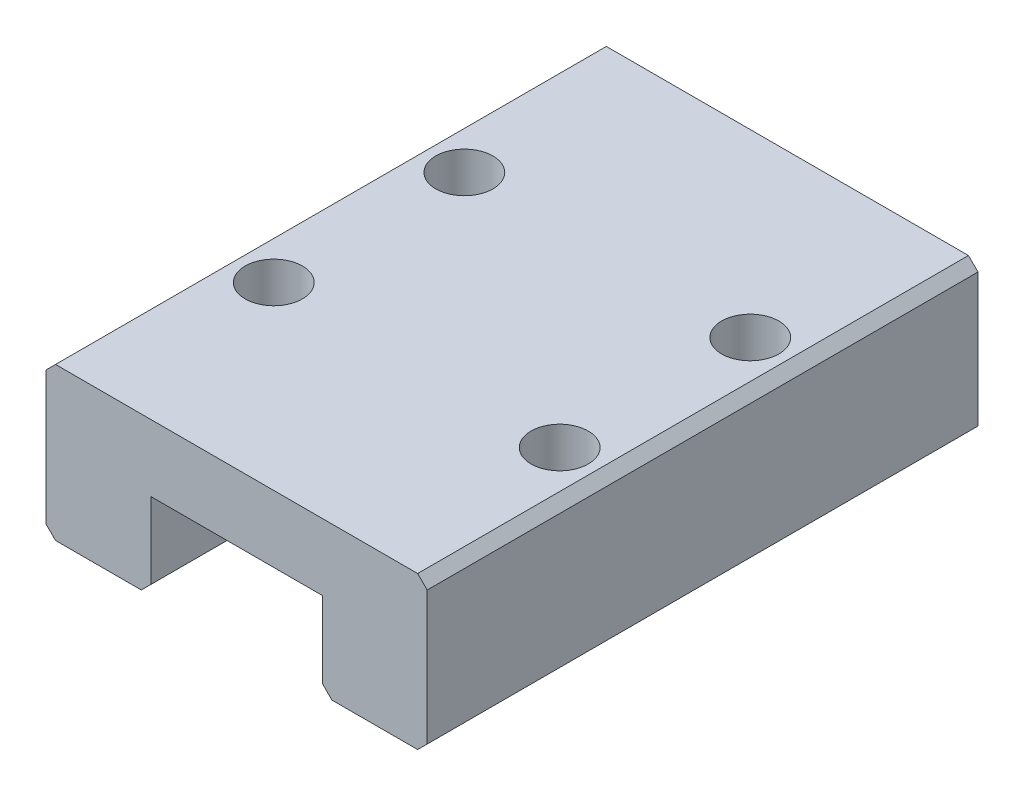
ISO-10303-21;
HEADER;
FILE_DESCRIPTION(('STEP AP214'),'2;1');
FILE_NAME('part.step','',(''),(''),'','','');
FILE_SCHEMA(('AUTOMOTIVE_DESIGN { 1 0 10303 214 1 1 1 1 }'));
ENDSEC;
DATA;
#1=APPLICATION_CONTEXT('core data for automotive mechanical design processes');
#2=APPLICATION_PROTOCOL_DEFINITION('international standard','automotive_design',2000,#1);
#3=PRODUCT_CONTEXT('',#1,'mechanical');
#4=PRODUCT('Part','Part','',(#3));
#5=PRODUCT_RELATED_PRODUCT_CATEGORY('part','',(#4));
#6=PRODUCT_DEFINITION_FORMATION('','',#4);
#7=PRODUCT_DEFINITION_CONTEXT('part definition',#1,'design');
#8=PRODUCT_DEFINITION('design','',#6,#7);
#9=PRODUCT_DEFINITION_SHAPE('','',#8);
#10=(LENGTH_UNIT() NAMED_UNIT(*) SI_UNIT(.MILLI.,.METRE.));
#11=(NAMED_UNIT(*) PLANE_ANGLE_UNIT() SI_UNIT($,.RADIAN.));
#12=(NAMED_UNIT(*) SI_UNIT($,.STERADIAN.) SOLID_ANGLE_UNIT());
#13=UNCERTAINTY_MEASURE_WITH_UNIT(LENGTH_MEASURE(1.E-05),#10,'distance_accuracy_value','');
#14=(GEOMETRIC_REPRESENTATION_CONTEXT(3) GLOBAL_UNCERTAINTY_ASSIGNED_CONTEXT((#13)) GLOBAL_UNIT_ASSIGNED_CONTEXT((#10,
#11,#12)) REPRESENTATION_CONTEXT('',''));
#15=CARTESIAN_POINT('',(0.,0.,0.));
#16=DIRECTION('',(0.,0.,1.));
#17=DIRECTION('',(1.,0.,0.));
#18=AXIS2_PLACEMENT_3D('',#15,#16,#17);
#19=CARTESIAN_POINT('',(4.5,0.,14.45));
#20=DIRECTION('',(1.,0.,0.));
#21=DIRECTION('',(0.,1.,0.));
#22=AXIS2_PLACEMENT_3D('',#19,#20,#21);
#23=PLANE('',#22);
#24=DIRECTION('',(0.,-1.,0.));
#25=VECTOR('',#24,1.);
#26=CARTESIAN_POINT('',(4.5,0.,-14.45));
#27=LINE('',#26,#25);
#28=CARTESIAN_POINT('',(4.5,0.,-14.45));
#29=VERTEX_POINT('',#28);
#30=CARTESIAN_POINT('',(4.5,-4.,-14.45));
#31=VERTEX_POINT('',#30);
#32=EDGE_CURVE('E169',#29,#31,#27,.T.);
#33=ORIENTED_EDGE('',*,*,#32,.T.);
#34=DIRECTION('',(0.,0.,1.));
#35=VECTOR('',#34,1.);
#36=CARTESIAN_POINT('',(4.5,-4.,14.45));
#37=LINE('',#36,#35);
#38=CARTESIAN_POINT('',(4.5,-4.,14.45));
#39=VERTEX_POINT('',#38);
#40=EDGE_CURVE('E207',#31,#39,#37,.T.);
#41=ORIENTED_EDGE('',*,*,#40,.T.);
#42=DIRECTION('',(0.,-1.,0.));
#43=VECTOR('',#42,1.);
#44=CARTESIAN_POINT('',(4.5,0.,14.45));
#45=LINE('',#44,#43);
#46=CARTESIAN_POINT('',(4.5,0.,14.45));
#47=VERTEX_POINT('',#46);
#48=EDGE_CURVE('E189',#47,#39,#45,.T.);
#49=ORIENTED_EDGE('',*,*,#48,.F.);
#50=DIRECTION('',(0.,0.,-1.));
#51=VECTOR('',#50,1.);
#52=CARTESIAN_POINT('',(4.5,0.,14.45));
#53=LINE('',#52,#51);
#54=EDGE_CURVE('E160',#47,#29,#53,.T.);
#55=ORIENTED_EDGE('',*,*,#54,.T.);
#56=EDGE_LOOP('',(#33,#41,#49,#55));
#57=FACE_BOUND('',#56,.T.);
#58=ADVANCED_FACE('F39',(#57),#23,.F.);
#59=CARTESIAN_POINT('',(4.5,-4.5,14.45));
#60=DIRECTION('',(0.,1.,0.));
#61=DIRECTION('',(-1.,0.,0.));
#62=AXIS2_PLACEMENT_3D('',#59,#60,#61);
#63=PLANE('',#62);
#64=DIRECTION('',(1.,0.,0.));
#65=VECTOR('',#64,1.);
#66=CARTESIAN_POINT('',(4.5,-4.5,14.45));
#67=LINE('',#66,#65);
#68=CARTESIAN_POINT('',(5.,-4.5,14.45));
#69=VERTEX_POINT('',#68);
#70=CARTESIAN_POINT('',(9.49999999999999,-4.5,14.45));
#71=VERTEX_POINT('',#70);
#72=EDGE_CURVE('E269',#69,#71,#67,.T.);
#73=ORIENTED_EDGE('',*,*,#72,.F.);
#74=DIRECTION('',(0.,0.,-1.));
#75=VECTOR('',#74,1.);
#76=CARTESIAN_POINT('',(5.,-4.5,14.45));
#77=LINE('',#76,#75);
#78=CARTESIAN_POINT('',(5.,-4.5,-14.45));
#79=VERTEX_POINT('',#78);
#80=EDGE_CURVE('E192',#69,#79,#77,.T.);
#81=ORIENTED_EDGE('',*,*,#80,.T.);
#82=DIRECTION('',(1.,0.,0.));
#83=VECTOR('',#82,1.);
#84=CARTESIAN_POINT('',(4.5,-4.5,-14.45));
#85=LINE('',#84,#83);
#86=CARTESIAN_POINT('',(9.49999999999999,-4.5,-14.45));
#87=VERTEX_POINT('',#86);
#88=EDGE_CURVE('E172',#79,#87,#85,.T.);
#89=ORIENTED_EDGE('',*,*,#88,.T.);
#90=DIRECTION('',(0.,0.,1.));
#91=VECTOR('',#90,1.);
#92=CARTESIAN_POINT('',(9.49999999999999,-4.5,14.45));
#93=LINE('',#92,#91);
#94=EDGE_CURVE('E159',#87,#71,#93,.T.);
#95=ORIENTED_EDGE('',*,*,#94,.T.);
#96=EDGE_LOOP('',(#73,#81,#89,#95));
#97=FACE_BOUND('',#96,.T.);
#98=ADVANCED_FACE('F327',(#97),#63,.F.);
#99=CARTESIAN_POINT('',(10.,-4.5,14.45));
#100=DIRECTION('',(-1.,0.,0.));
#101=DIRECTION('',(0.,0.,1.));
#102=AXIS2_PLACEMENT_3D('',#99,#100,#101);
#103=PLANE('',#102);
#104=DIRECTION('',(0.,1.,0.));
#105=VECTOR('',#104,1.);
#106=CARTESIAN_POINT('',(10.,-4.5,14.45));
#107=LINE('',#106,#105);
#108=CARTESIAN_POINT('',(10.,-4.,14.45));
#109=VERTEX_POINT('',#108);
#110=CARTESIAN_POINT('',(10.,3.00000000000001,14.45));
#111=VERTEX_POINT('',#110);
#112=EDGE_CURVE('E250',#109,#111,#107,.T.);
#113=ORIENTED_EDGE('',*,*,#112,.F.);
#114=DIRECTION('',(0.,0.,-1.));
#115=VECTOR('',#114,1.);
#116=CARTESIAN_POINT('',(10.,-4.,14.45));
#117=LINE('',#116,#115);
#118=CARTESIAN_POINT('',(10.,-4.,-14.45));
#119=VERTEX_POINT('',#118);
#120=EDGE_CURVE('E228',#109,#119,#117,.T.);
#121=ORIENTED_EDGE('',*,*,#120,.T.);
#122=DIRECTION('',(0.,1.,0.));
#123=VECTOR('',#122,1.);
#124=CARTESIAN_POINT('',(10.,-4.5,-14.45));
#125=LINE('',#124,#123);
#126=CARTESIAN_POINT('',(10.,3.00000000000001,-14.45));
#127=VERTEX_POINT('',#126);
#128=EDGE_CURVE('E176',#119,#127,#125,.T.);
#129=ORIENTED_EDGE('',*,*,#128,.T.);
#130=DIRECTION('',(0.,0.,1.));
#131=VECTOR('',#130,1.);
#132=CARTESIAN_POINT('',(10.,3.00000000000001,14.45));
#133=LINE('',#132,#131);
#134=EDGE_CURVE('E226',#127,#111,#133,.T.);
#135=ORIENTED_EDGE('',*,*,#134,.T.);
#136=EDGE_LOOP('',(#113,#121,#129,#135));
#137=FACE_BOUND('',#136,.T.);
#138=ADVANCED_FACE('F308',(#137),#103,.F.);
#139=CARTESIAN_POINT('',(-10.,3.5,14.45));
#140=DIRECTION('',(0.,-1.,0.));
#141=DIRECTION('',(1.,0.,0.));
#142=AXIS2_PLACEMENT_3D('',#139,#140,#141);
#143=PLANE('',#142);
#144=CARTESIAN_POINT('',(7.49999999999999,3.5,-5.));
#145=DIRECTION('',(0.,1.,0.));
#146=DIRECTION('',(-1.,0.,0.));
#147=AXIS2_PLACEMENT_3D('',#144,#145,#146);
#148=CIRCLE('',#147,1.5);
#149=CARTESIAN_POINT('',(6.,3.5,-5.));
#150=VERTEX_POINT('',#149);
#151=EDGE_CURVE('E286',#150,#150,#148,.T.);
#152=ORIENTED_EDGE('',*,*,#151,.F.);
#153=EDGE_LOOP('',(#152));
#154=FACE_BOUND('',#153,.T.);
#155=CARTESIAN_POINT('',(-7.50000000000001,3.5,5.));
#156=DIRECTION('',(0.,1.,0.));
#157=DIRECTION('',(-1.,0.,0.));
#158=AXIS2_PLACEMENT_3D('',#155,#156,#157);
#159=CIRCLE('',#158,1.5);
#160=CARTESIAN_POINT('',(-9.00000000000001,3.50000000000001,5.));
#161=VERTEX_POINT('',#160);
#162=EDGE_CURVE('E279',#161,#161,#159,.T.);
#163=ORIENTED_EDGE('',*,*,#162,.F.);
#164=EDGE_LOOP('',(#163));
#165=FACE_BOUND('',#164,.T.);
#166=CARTESIAN_POINT('',(7.49999999999999,3.5,5.));
#167=DIRECTION('',(0.,1.,0.));
#168=DIRECTION('',(-1.,0.,0.));
#169=AXIS2_PLACEMENT_3D('',#166,#167,#168);
#170=CIRCLE('',#169,1.5);
#171=CARTESIAN_POINT('',(5.99999999999999,3.5,5.));
#172=VERTEX_POINT('',#171);
#173=EDGE_CURVE('E291',#172,#172,#170,.T.);
#174=ORIENTED_EDGE('',*,*,#173,.F.);
#175=EDGE_LOOP('',(#174));
#176=FACE_BOUND('',#175,.T.);
#177=CARTESIAN_POINT('',(-7.50000000000001,3.5,-5.));
#178=DIRECTION('',(0.,1.,0.));
#179=DIRECTION('',(-1.,0.,0.));
#180=AXIS2_PLACEMENT_3D('',#177,#178,#179);
#181=CIRCLE('',#180,1.5);
#182=CARTESIAN_POINT('',(-9.00000000000001,3.50000000000001,-5.));
#183=VERTEX_POINT('',#182);
#184=EDGE_CURVE('E273',#183,#183,#181,.T.);
#185=ORIENTED_EDGE('',*,*,#184,.F.);
#186=EDGE_LOOP('',(#185));
#187=FACE_BOUND('',#186,.T.);
#188=DIRECTION('',(-1.,0.,0.));
#189=VECTOR('',#188,1.);
#190=CARTESIAN_POINT('',(-10.,3.5,14.45));
#191=LINE('',#190,#189);
#192=CARTESIAN_POINT('',(9.5,3.5,14.45));
#193=VERTEX_POINT('',#192);
#194=CARTESIAN_POINT('',(-9.5,3.5,14.45));
#195=VERTEX_POINT('',#194);
#196=EDGE_CURVE('E240',#193,#195,#191,.T.);
#197=ORIENTED_EDGE('',*,*,#196,.F.);
#198=DIRECTION('',(0.,0.,-1.));
#199=VECTOR('',#198,1.);
#200=CARTESIAN_POINT('',(9.5,3.5,14.45));
#201=LINE('',#200,#199);
#202=CARTESIAN_POINT('',(9.5,3.5,-14.45));
#203=VERTEX_POINT('',#202);
#204=EDGE_CURVE('E11',#193,#203,#201,.T.);
#205=ORIENTED_EDGE('',*,*,#204,.T.);
#206=DIRECTION('',(-1.,0.,0.));
#207=VECTOR('',#206,1.);
#208=CARTESIAN_POINT('',(-10.,3.5,-14.45));
#209=LINE('',#208,#207);
#210=CARTESIAN_POINT('',(-9.5,3.5,-14.45));
#211=VERTEX_POINT('',#210);
#212=EDGE_CURVE('E179',#203,#211,#209,.T.);
#213=ORIENTED_EDGE('',*,*,#212,.T.);
#214=DIRECTION('',(0.,0.,1.));
#215=VECTOR('',#214,1.);
#216=CARTESIAN_POINT('',(-9.5,3.5,14.45));
#217=LINE('',#216,#215);
#218=EDGE_CURVE('E48',#211,#195,#217,.T.);
#219=ORIENTED_EDGE('',*,*,#218,.T.);
#220=EDGE_LOOP('',(#197,#205,#213,#219));
#221=FACE_BOUND('',#220,.T.);
#222=ADVANCED_FACE('F239',(#154,#165,#176,#187,#221),#143,.F.);
#223=CARTESIAN_POINT('',(-10.,-4.5,14.45));
#224=DIRECTION('',(1.,0.,0.));
#225=DIRECTION('',(0.,0.,-1.));
#226=AXIS2_PLACEMENT_3D('',#223,#224,#225);
#227=PLANE('',#226);
#228=DIRECTION('',(0.,-1.,0.));
#229=VECTOR('',#228,1.);
#230=CARTESIAN_POINT('',(-10.,-4.5,-14.45));
#231=LINE('',#230,#229);
#232=CARTESIAN_POINT('',(-10.,3.,-14.45));
#233=VERTEX_POINT('',#232);
#234=CARTESIAN_POINT('',(-10.,-4.,-14.45));
#235=VERTEX_POINT('',#234);
#236=EDGE_CURVE('E182',#233,#235,#231,.T.);
#237=ORIENTED_EDGE('',*,*,#236,.T.);
#238=DIRECTION('',(0.,0.,1.));
#239=VECTOR('',#238,1.);
#240=CARTESIAN_POINT('',(-10.,-4.,14.45));
#241=LINE('',#240,#239);
#242=CARTESIAN_POINT('',(-10.,-4.,14.45));
#243=VERTEX_POINT('',#242);
#244=EDGE_CURVE('E234',#235,#243,#241,.T.);
#245=ORIENTED_EDGE('',*,*,#244,.T.);
#246=DIRECTION('',(0.,-1.,0.));
#247=VECTOR('',#246,1.);
#248=CARTESIAN_POINT('',(-10.,-4.5,14.45));
#249=LINE('',#248,#247);
#250=CARTESIAN_POINT('',(-10.,3.,14.45));
#251=VERTEX_POINT('',#250);
#252=EDGE_CURVE('E249',#251,#243,#249,.T.);
#253=ORIENTED_EDGE('',*,*,#252,.F.);
#254=DIRECTION('',(0.,0.,-1.));
#255=VECTOR('',#254,1.);
#256=CARTESIAN_POINT('',(-10.,3.,14.45));
#257=LINE('',#256,#255);
#258=EDGE_CURVE('E231',#251,#233,#257,.T.);
#259=ORIENTED_EDGE('',*,*,#258,.T.);
#260=EDGE_LOOP('',(#237,#245,#253,#259));
#261=FACE_BOUND('',#260,.T.);
#262=ADVANCED_FACE('F255',(#261),#227,.F.);
#263=CARTESIAN_POINT('',(-4.5,-4.5,14.45));
#264=DIRECTION('',(0.,1.,0.));
#265=DIRECTION('',(-1.,0.,0.));
#266=AXIS2_PLACEMENT_3D('',#263,#264,#265);
#267=PLANE('',#266);
#268=DIRECTION('',(1.,0.,0.));
#269=VECTOR('',#268,1.);
#270=CARTESIAN_POINT('',(-4.5,-4.5,-14.45));
#271=LINE('',#270,#269);
#272=CARTESIAN_POINT('',(-9.5,-4.5,-14.45));
#273=VERTEX_POINT('',#272);
#274=CARTESIAN_POINT('',(-5.,-4.5,-14.45));
#275=VERTEX_POINT('',#274);
#276=EDGE_CURVE('E185',#273,#275,#271,.T.);
#277=ORIENTED_EDGE('',*,*,#276,.T.);
#278=DIRECTION('',(0.,0.,1.));
#279=VECTOR('',#278,1.);
#280=CARTESIAN_POINT('',(-5.,-4.5,14.45));
#281=LINE('',#280,#279);
#282=CARTESIAN_POINT('',(-5.,-4.5,14.45));
#283=VERTEX_POINT('',#282);
#284=EDGE_CURVE('E63',#275,#283,#281,.T.);
#285=ORIENTED_EDGE('',*,*,#284,.T.);
#286=DIRECTION('',(1.,0.,0.));
#287=VECTOR('',#286,1.);
#288=CARTESIAN_POINT('',(-4.5,-4.5,14.45));
#289=LINE('',#288,#287);
#290=CARTESIAN_POINT('',(-9.5,-4.5,14.45));
#291=VERTEX_POINT('',#290);
#292=EDGE_CURVE('E150',#291,#283,#289,.T.);
#293=ORIENTED_EDGE('',*,*,#292,.F.);
#294=DIRECTION('',(0.,0.,-1.));
#295=VECTOR('',#294,1.);
#296=CARTESIAN_POINT('',(-9.5,-4.5,14.45));
#297=LINE('',#296,#295);
#298=EDGE_CURVE('E222',#291,#273,#297,.T.);
#299=ORIENTED_EDGE('',*,*,#298,.T.);
#300=EDGE_LOOP('',(#277,#285,#293,#299));
#301=FACE_BOUND('',#300,.T.);
#302=ADVANCED_FACE('F265',(#301),#267,.F.);
#303=CARTESIAN_POINT('',(-4.5,0.,14.45));
#304=DIRECTION('',(-1.,0.,0.));
#305=DIRECTION('',(0.,-1.,0.));
#306=AXIS2_PLACEMENT_3D('',#303,#304,#305);
#307=PLANE('',#306);
#308=DIRECTION('',(0.,1.,0.));
#309=VECTOR('',#308,1.);
#310=CARTESIAN_POINT('',(-4.5,0.,14.45));
#311=LINE('',#310,#309);
#312=CARTESIAN_POINT('',(-4.5,-4.,14.45));
#313=VERTEX_POINT('',#312);
#314=CARTESIAN_POINT('',(-4.5,0.,14.45));
#315=VERTEX_POINT('',#314);
#316=EDGE_CURVE('E140',#313,#315,#311,.T.);
#317=ORIENTED_EDGE('',*,*,#316,.F.);
#318=DIRECTION('',(0.,0.,-1.));
#319=VECTOR('',#318,1.);
#320=CARTESIAN_POINT('',(-4.5,-4.,14.45));
#321=LINE('',#320,#319);
#322=CARTESIAN_POINT('',(-4.5,-4.,-14.45));
#323=VERTEX_POINT('',#322);
#324=EDGE_CURVE('E220',#313,#323,#321,.T.);
#325=ORIENTED_EDGE('',*,*,#324,.T.);
#326=DIRECTION('',(0.,1.,0.));
#327=VECTOR('',#326,1.);
#328=CARTESIAN_POINT('',(-4.5,0.,-14.45));
#329=LINE('',#328,#327);
#330=CARTESIAN_POINT('',(-4.5,0.,-14.45));
#331=VERTEX_POINT('',#330);
#332=EDGE_CURVE('E156',#323,#331,#329,.T.);
#333=ORIENTED_EDGE('',*,*,#332,.T.);
#334=DIRECTION('',(0.,0.,-1.));
#335=VECTOR('',#334,1.);
#336=CARTESIAN_POINT('',(-4.5,0.,14.45));
#337=LINE('',#336,#335);
#338=EDGE_CURVE('E153',#315,#331,#337,.T.);
#339=ORIENTED_EDGE('',*,*,#338,.F.);
#340=EDGE_LOOP('',(#317,#325,#333,#339));
#341=FACE_BOUND('',#340,.T.);
#342=ADVANCED_FACE('F154',(#341),#307,.F.);
#343=CARTESIAN_POINT('',(4.5,0.,14.45));
#344=DIRECTION('',(0.,1.,0.));
#345=DIRECTION('',(-1.,0.,0.));
#346=AXIS2_PLACEMENT_3D('',#343,#344,#345);
#347=PLANE('',#346);
#348=DIRECTION('',(1.,0.,0.));
#349=VECTOR('',#348,1.);
#350=CARTESIAN_POINT('',(4.5,0.,-14.45));
#351=LINE('',#350,#349);
#352=EDGE_CURVE('E188',#331,#29,#351,.T.);
#353=ORIENTED_EDGE('',*,*,#352,.T.);
#354=ORIENTED_EDGE('',*,*,#54,.F.);
#355=DIRECTION('',(1.,0.,0.));
#356=VECTOR('',#355,1.);
#357=CARTESIAN_POINT('',(4.5,0.,14.45));
#358=LINE('',#357,#356);
#359=EDGE_CURVE('E145',#315,#47,#358,.T.);
#360=ORIENTED_EDGE('',*,*,#359,.F.);
#361=ORIENTED_EDGE('',*,*,#338,.T.);
#362=EDGE_LOOP('',(#353,#354,#360,#361));
#363=FACE_BOUND('',#362,.T.);
#364=ADVANCED_FACE('F162',(#363),#347,.F.);
#365=CARTESIAN_POINT('',(0.,0.,14.45));
#366=DIRECTION('',(0.,0.,1.));
#367=DIRECTION('',(1.,0.,0.));
#368=AXIS2_PLACEMENT_3D('',#365,#366,#367);
#369=PLANE('',#368);
#370=ORIENTED_EDGE('',*,*,#48,.T.);
#371=DIRECTION('',(-0.707106781186548,0.707106781186548,0.));
#372=VECTOR('',#371,1.);
#373=CARTESIAN_POINT('',(0.249999999999999,0.249999999999999,14.45));
#374=LINE('',#373,#372);
#375=EDGE_CURVE('E218',#39,#69,#374,.F.);
#376=ORIENTED_EDGE('',*,*,#375,.T.);
#377=ORIENTED_EDGE('',*,*,#72,.T.);
#378=DIRECTION('',(-0.70710678118655,-0.707106781186545,0.));
#379=VECTOR('',#378,1.);
#380=CARTESIAN_POINT('',(6.99999999999996,-7.00000000000001,14.45));
#381=LINE('',#380,#379);
#382=EDGE_CURVE('E215',#71,#109,#381,.F.);
#383=ORIENTED_EDGE('',*,*,#382,.T.);
#384=ORIENTED_EDGE('',*,*,#112,.T.);
#385=DIRECTION('',(0.707106781186548,-0.707106781186548,0.));
#386=VECTOR('',#385,1.);
#387=CARTESIAN_POINT('',(6.5,6.5,14.45));
#388=LINE('',#387,#386);
#389=EDGE_CURVE('E211',#111,#193,#388,.F.);
#390=ORIENTED_EDGE('',*,*,#389,.T.);
#391=ORIENTED_EDGE('',*,*,#196,.T.);
#392=DIRECTION('',(0.707106781186548,0.707106781186548,0.));
#393=VECTOR('',#392,1.);
#394=CARTESIAN_POINT('',(-6.5,6.5,14.45));
#395=LINE('',#394,#393);
#396=EDGE_CURVE('E209',#195,#251,#395,.F.);
#397=ORIENTED_EDGE('',*,*,#396,.T.);
#398=ORIENTED_EDGE('',*,*,#252,.T.);
#399=DIRECTION('',(-0.707106781186548,0.707106781186548,0.));
#400=VECTOR('',#399,1.);
#401=CARTESIAN_POINT('',(-7.,-7.,14.45));
#402=LINE('',#401,#400);
#403=EDGE_CURVE('E213',#243,#291,#402,.F.);
#404=ORIENTED_EDGE('',*,*,#403,.T.);
#405=ORIENTED_EDGE('',*,*,#292,.T.);
#406=DIRECTION('',(-0.707106781186548,-0.707106781186548,0.));
#407=VECTOR('',#406,1.);
#408=CARTESIAN_POINT('',(-0.250000000000001,0.250000000000001,14.45));
#409=LINE('',#408,#407);
#410=EDGE_CURVE('E55',#283,#313,#409,.F.);
#411=ORIENTED_EDGE('',*,*,#410,.T.);
#412=ORIENTED_EDGE('',*,*,#316,.T.);
#413=ORIENTED_EDGE('',*,*,#359,.T.);
#414=EDGE_LOOP('',(#370,#376,#377,#383,#384,#390,#391,#397,#398,#404,#405,#411,#412,#413));
#415=FACE_BOUND('',#414,.T.);
#416=ADVANCED_FACE('F143',(#415),#369,.T.);
#417=CARTESIAN_POINT('',(0.,0.,-14.45));
#418=DIRECTION('',(0.,0.,1.));
#419=DIRECTION('',(1.,0.,0.));
#420=AXIS2_PLACEMENT_3D('',#417,#418,#419);
#421=PLANE('',#420);
#422=ORIENTED_EDGE('',*,*,#88,.F.);
#423=DIRECTION('',(0.707106781186548,-0.707106781186548,0.));
#424=VECTOR('',#423,1.);
#425=CARTESIAN_POINT('',(5.,-4.5,-14.45));
#426=LINE('',#425,#424);
#427=EDGE_CURVE('E205',#79,#31,#426,.F.);
#428=ORIENTED_EDGE('',*,*,#427,.T.);
#429=ORIENTED_EDGE('',*,*,#32,.F.);
#430=ORIENTED_EDGE('',*,*,#352,.F.);
#431=ORIENTED_EDGE('',*,*,#332,.F.);
#432=DIRECTION('',(0.707106781186548,0.707106781186548,0.));
#433=VECTOR('',#432,1.);
#434=CARTESIAN_POINT('',(-4.5,-4.,-14.45));
#435=LINE('',#434,#433);
#436=EDGE_CURVE('E203',#323,#275,#435,.F.);
#437=ORIENTED_EDGE('',*,*,#436,.T.);
#438=ORIENTED_EDGE('',*,*,#276,.F.);
#439=DIRECTION('',(0.707106781186548,-0.707106781186548,0.));
#440=VECTOR('',#439,1.);
#441=CARTESIAN_POINT('',(-9.5,-4.5,-14.45));
#442=LINE('',#441,#440);
#443=EDGE_CURVE('E199',#273,#235,#442,.F.);
#444=ORIENTED_EDGE('',*,*,#443,.T.);
#445=ORIENTED_EDGE('',*,*,#236,.F.);
#446=DIRECTION('',(-0.707106781186548,-0.707106781186548,0.));
#447=VECTOR('',#446,1.);
#448=CARTESIAN_POINT('',(-10.,3.,-14.45));
#449=LINE('',#448,#447);
#450=EDGE_CURVE('E195',#233,#211,#449,.F.);
#451=ORIENTED_EDGE('',*,*,#450,.T.);
#452=ORIENTED_EDGE('',*,*,#212,.F.);
#453=DIRECTION('',(-0.707106781186548,0.707106781186548,0.));
#454=VECTOR('',#453,1.);
#455=CARTESIAN_POINT('',(9.5,3.5,-14.45));
#456=LINE('',#455,#454);
#457=EDGE_CURVE('E197',#203,#127,#456,.F.);
#458=ORIENTED_EDGE('',*,*,#457,.T.);
#459=ORIENTED_EDGE('',*,*,#128,.F.);
#460=DIRECTION('',(0.70710678118655,0.707106781186545,0.));
#461=VECTOR('',#460,1.);
#462=CARTESIAN_POINT('',(10.,-4.,-14.45));
#463=LINE('',#462,#461);
#464=EDGE_CURVE('E201',#119,#87,#463,.F.);
#465=ORIENTED_EDGE('',*,*,#464,.T.);
#466=EDGE_LOOP('',(#422,#428,#429,#430,#431,#437,#438,#444,#445,#451,#452,#458,#459,#465));
#467=FACE_BOUND('',#466,.T.);
#468=ADVANCED_FACE('F259',(#467),#421,.F.);
#469=CARTESIAN_POINT('',(-7.50000000000001,0.500000000000004,-5.));
#470=DIRECTION('',(0.,1.,0.));
#471=DIRECTION('',(-1.,0.,0.));
#472=AXIS2_PLACEMENT_3D('',#469,#470,#471);
#473=CYLINDRICAL_SURFACE('',#472,1.5);
#474=CARTESIAN_POINT('',(-7.50000000000001,0.500000000000004,-5.));
#475=DIRECTION('',(0.,1.,0.));
#476=DIRECTION('',(-1.,0.,0.));
#477=AXIS2_PLACEMENT_3D('',#474,#475,#476);
#478=CIRCLE('',#477,1.5);
#479=CARTESIAN_POINT('',(-9.00000000000001,0.500000000000005,-5.));
#480=VERTEX_POINT('',#479);
#481=EDGE_CURVE('E173',#480,#480,#478,.T.);
#482=ORIENTED_EDGE('',*,*,#481,.F.);
#483=EDGE_LOOP('',(#482));
#484=FACE_BOUND('',#483,.T.);
#485=ORIENTED_EDGE('',*,*,#184,.T.);
#486=EDGE_LOOP('',(#485));
#487=FACE_BOUND('',#486,.T.);
#488=ADVANCED_FACE('F313',(#484,#487),#473,.F.);
#489=CARTESIAN_POINT('',(-7.50000000000001,0.500000000000004,-5.));
#490=DIRECTION('',(0.,1.,0.));
#491=DIRECTION('',(-1.,0.,0.));
#492=AXIS2_PLACEMENT_3D('',#489,#490,#491);
#493=PLANE('',#492);
#494=ORIENTED_EDGE('',*,*,#481,.T.);
#495=EDGE_LOOP('',(#494));
#496=FACE_BOUND('',#495,.T.);
#497=ADVANCED_FACE('F302',(#496),#493,.T.);
#498=CARTESIAN_POINT('',(7.49999999999999,0.499999999999997,5.));
#499=DIRECTION('',(0.,1.,0.));
#500=DIRECTION('',(-1.,0.,0.));
#501=AXIS2_PLACEMENT_3D('',#498,#499,#500);
#502=CYLINDRICAL_SURFACE('',#501,1.5);
#503=CARTESIAN_POINT('',(7.49999999999999,0.499999999999997,5.));
#504=DIRECTION('',(0.,1.,0.));
#505=DIRECTION('',(-1.,0.,0.));
#506=AXIS2_PLACEMENT_3D('',#503,#504,#505);
#507=CIRCLE('',#506,1.5);
#508=CARTESIAN_POINT('',(5.99999999999999,0.499999999999998,5.));
#509=VERTEX_POINT('',#508);
#510=EDGE_CURVE('E283',#509,#509,#507,.T.);
#511=ORIENTED_EDGE('',*,*,#510,.F.);
#512=EDGE_LOOP('',(#511));
#513=FACE_BOUND('',#512,.T.);
#514=ORIENTED_EDGE('',*,*,#173,.T.);
#515=EDGE_LOOP('',(#514));
#516=FACE_BOUND('',#515,.T.);
#517=ADVANCED_FACE('F299',(#513,#516),#502,.F.);
#518=CARTESIAN_POINT('',(7.49999999999999,0.499999999999997,5.));
#519=DIRECTION('',(0.,1.,0.));
#520=DIRECTION('',(-1.,0.,0.));
#521=AXIS2_PLACEMENT_3D('',#518,#519,#520);
#522=PLANE('',#521);
#523=ORIENTED_EDGE('',*,*,#510,.T.);
#524=EDGE_LOOP('',(#523));
#525=FACE_BOUND('',#524,.T.);
#526=ADVANCED_FACE('F297',(#525),#522,.T.);
#527=CARTESIAN_POINT('',(-7.50000000000001,0.500000000000004,5.));
#528=DIRECTION('',(0.,1.,0.));
#529=DIRECTION('',(-1.,0.,0.));
#530=AXIS2_PLACEMENT_3D('',#527,#528,#529);
#531=CYLINDRICAL_SURFACE('',#530,1.5);
#532=CARTESIAN_POINT('',(-7.50000000000001,0.500000000000004,5.));
#533=DIRECTION('',(0.,1.,0.));
#534=DIRECTION('',(-1.,0.,0.));
#535=AXIS2_PLACEMENT_3D('',#532,#533,#534);
#536=CIRCLE('',#535,1.5);
#537=CARTESIAN_POINT('',(-9.00000000000001,0.500000000000005,5.));
#538=VERTEX_POINT('',#537);
#539=EDGE_CURVE('E282',#538,#538,#536,.T.);
#540=ORIENTED_EDGE('',*,*,#539,.F.);
#541=EDGE_LOOP('',(#540));
#542=FACE_BOUND('',#541,.T.);
#543=ORIENTED_EDGE('',*,*,#162,.T.);
#544=EDGE_LOOP('',(#543));
#545=FACE_BOUND('',#544,.T.);
#546=ADVANCED_FACE('F464',(#542,#545),#531,.F.);
#547=CARTESIAN_POINT('',(-7.50000000000001,0.500000000000004,5.));
#548=DIRECTION('',(0.,1.,0.));
#549=DIRECTION('',(-1.,0.,0.));
#550=AXIS2_PLACEMENT_3D('',#547,#548,#549);
#551=PLANE('',#550);
#552=ORIENTED_EDGE('',*,*,#539,.T.);
#553=EDGE_LOOP('',(#552));
#554=FACE_BOUND('',#553,.T.);
#555=ADVANCED_FACE('F456',(#554),#551,.T.);
#556=CARTESIAN_POINT('',(7.49999999999999,0.499999999999997,-5.));
#557=DIRECTION('',(0.,1.,0.));
#558=DIRECTION('',(-1.,0.,0.));
#559=AXIS2_PLACEMENT_3D('',#556,#557,#558);
#560=CYLINDRICAL_SURFACE('',#559,1.5);
#561=CARTESIAN_POINT('',(7.49999999999999,0.499999999999997,-5.));
#562=DIRECTION('',(0.,1.,0.));
#563=DIRECTION('',(-1.,0.,0.));
#564=AXIS2_PLACEMENT_3D('',#561,#562,#563);
#565=CIRCLE('',#564,1.5);
#566=CARTESIAN_POINT('',(5.99999999999999,0.499999999999998,-5.));
#567=VERTEX_POINT('',#566);
#568=EDGE_CURVE('E276',#567,#567,#565,.T.);
#569=ORIENTED_EDGE('',*,*,#568,.F.);
#570=EDGE_LOOP('',(#569));
#571=FACE_BOUND('',#570,.T.);
#572=ORIENTED_EDGE('',*,*,#151,.T.);
#573=EDGE_LOOP('',(#572));
#574=FACE_BOUND('',#573,.T.);
#575=ADVANCED_FACE('F449',(#571,#574),#560,.F.);
#576=CARTESIAN_POINT('',(7.49999999999999,0.499999999999997,-5.));
#577=DIRECTION('',(0.,1.,0.));
#578=DIRECTION('',(-1.,0.,0.));
#579=AXIS2_PLACEMENT_3D('',#576,#577,#578);
#580=PLANE('',#579);
#581=ORIENTED_EDGE('',*,*,#568,.T.);
#582=EDGE_LOOP('',(#581));
#583=FACE_BOUND('',#582,.T.);
#584=ADVANCED_FACE('F345',(#583),#580,.T.);
#585=CARTESIAN_POINT('',(5.,-4.5,14.45));
#586=DIRECTION('',(0.707106781186547,0.707106781186547,0.));
#587=DIRECTION('',(0.,0.,-1.));
#588=AXIS2_PLACEMENT_3D('',#585,#586,#587);
#589=PLANE('',#588);
#590=ORIENTED_EDGE('',*,*,#375,.F.);
#591=ORIENTED_EDGE('',*,*,#40,.F.);
#592=ORIENTED_EDGE('',*,*,#427,.F.);
#593=ORIENTED_EDGE('',*,*,#80,.F.);
#594=EDGE_LOOP('',(#590,#591,#592,#593));
#595=FACE_BOUND('',#594,.T.);
#596=ADVANCED_FACE('F338',(#595),#589,.F.);
#597=CARTESIAN_POINT('',(-4.5,-4.,14.45));
#598=DIRECTION('',(-0.707106781186547,0.707106781186547,0.));
#599=DIRECTION('',(0.,0.,-1.));
#600=AXIS2_PLACEMENT_3D('',#597,#598,#599);
#601=PLANE('',#600);
#602=ORIENTED_EDGE('',*,*,#410,.F.);
#603=ORIENTED_EDGE('',*,*,#284,.F.);
#604=ORIENTED_EDGE('',*,*,#436,.F.);
#605=ORIENTED_EDGE('',*,*,#324,.F.);
#606=EDGE_LOOP('',(#602,#603,#604,#605));
#607=FACE_BOUND('',#606,.T.);
#608=ADVANCED_FACE('F344',(#607),#601,.F.);
#609=CARTESIAN_POINT('',(10.,-4.,14.45));
#610=DIRECTION('',(-0.707106781186545,0.70710678118655,0.));
#611=DIRECTION('',(0.,0.,-1.));
#612=AXIS2_PLACEMENT_3D('',#609,#610,#611);
#613=PLANE('',#612);
#614=ORIENTED_EDGE('',*,*,#382,.F.);
#615=ORIENTED_EDGE('',*,*,#94,.F.);
#616=ORIENTED_EDGE('',*,*,#464,.F.);
#617=ORIENTED_EDGE('',*,*,#120,.F.);
#618=EDGE_LOOP('',(#614,#615,#616,#617));
#619=FACE_BOUND('',#618,.T.);
#620=ADVANCED_FACE('F352',(#619),#613,.F.);
#621=CARTESIAN_POINT('',(-9.5,-4.5,14.45));
#622=DIRECTION('',(0.707106781186547,0.707106781186547,0.));
#623=DIRECTION('',(0.,0.,-1.));
#624=AXIS2_PLACEMENT_3D('',#621,#622,#623);
#625=PLANE('',#624);
#626=ORIENTED_EDGE('',*,*,#403,.F.);
#627=ORIENTED_EDGE('',*,*,#244,.F.);
#628=ORIENTED_EDGE('',*,*,#443,.F.);
#629=ORIENTED_EDGE('',*,*,#298,.F.);
#630=EDGE_LOOP('',(#626,#627,#628,#629));
#631=FACE_BOUND('',#630,.T.);
#632=ADVANCED_FACE('F264',(#631),#625,.F.);
#633=CARTESIAN_POINT('',(9.5,3.5,14.45));
#634=DIRECTION('',(-0.707106781186547,-0.707106781186547,0.));
#635=DIRECTION('',(0.,0.,-1.));
#636=AXIS2_PLACEMENT_3D('',#633,#634,#635);
#637=PLANE('',#636);
#638=ORIENTED_EDGE('',*,*,#389,.F.);
#639=ORIENTED_EDGE('',*,*,#134,.F.);
#640=ORIENTED_EDGE('',*,*,#457,.F.);
#641=ORIENTED_EDGE('',*,*,#204,.F.);
#642=EDGE_LOOP('',(#638,#639,#640,#641));
#643=FACE_BOUND('',#642,.T.);
#644=ADVANCED_FACE('F364',(#643),#637,.F.);
#645=CARTESIAN_POINT('',(-10.,3.,14.45));
#646=DIRECTION('',(0.707106781186547,-0.707106781186547,0.));
#647=DIRECTION('',(0.,0.,-1.));
#648=AXIS2_PLACEMENT_3D('',#645,#646,#647);
#649=PLANE('',#648);
#650=ORIENTED_EDGE('',*,*,#396,.F.);
#651=ORIENTED_EDGE('',*,*,#218,.F.);
#652=ORIENTED_EDGE('',*,*,#450,.F.);
#653=ORIENTED_EDGE('',*,*,#258,.F.);
#654=EDGE_LOOP('',(#650,#651,#652,#653));
#655=FACE_BOUND('',#654,.T.);
#656=ADVANCED_FACE('F42',(#655),#649,.F.);
#657=CLOSED_SHELL('',(#58,#98,#138,#222,#262,#302,#342,#364,#416,#468,#488,#497,#517,#526,#546,
#555,#575,#584,#596,#608,#620,#632,#644,#656));
#658=MANIFOLD_SOLID_BREP('B2',#657);
#659=ADVANCED_BREP_SHAPE_REPRESENTATION('',(#18,#658),#14);
#660=SHAPE_DEFINITION_REPRESENTATION(#9,#659);
ENDSEC;
END-ISO-10303-21;
